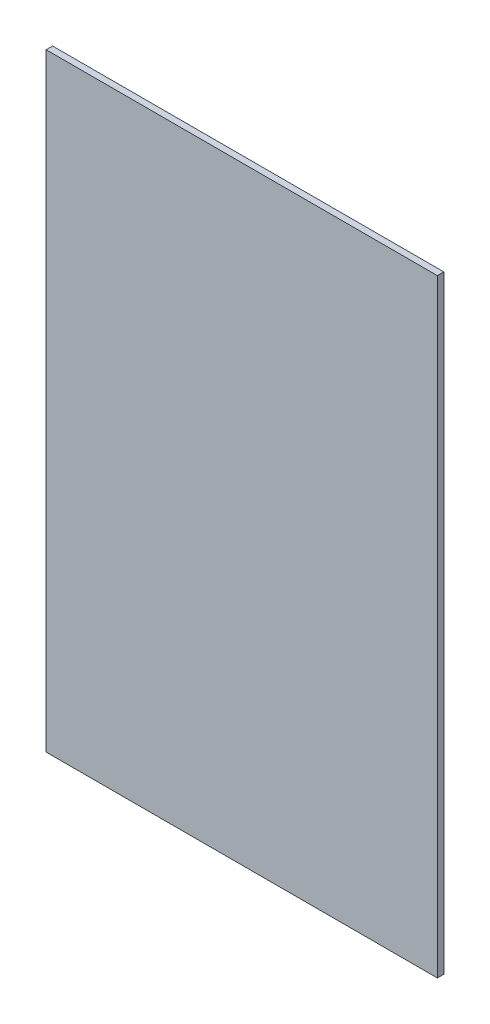
ISO-10303-21;
HEADER;
FILE_DESCRIPTION(('STEP AP214'),'2;1');
FILE_NAME('part.step','',(''),(''),'','','');
FILE_SCHEMA(('AUTOMOTIVE_DESIGN { 1 0 10303 214 1 1 1 1 }'));
ENDSEC;
DATA;
#1=APPLICATION_CONTEXT('core data for automotive mechanical design processes');
#2=APPLICATION_PROTOCOL_DEFINITION('international standard','automotive_design',2000,#1);
#3=PRODUCT_CONTEXT('',#1,'mechanical');
#4=PRODUCT('Part','Part','',(#3));
#5=PRODUCT_RELATED_PRODUCT_CATEGORY('part','',(#4));
#6=PRODUCT_DEFINITION_FORMATION('','',#4);
#7=PRODUCT_DEFINITION_CONTEXT('part definition',#1,'design');
#8=PRODUCT_DEFINITION('design','',#6,#7);
#9=PRODUCT_DEFINITION_SHAPE('','',#8);
#10=(LENGTH_UNIT() NAMED_UNIT(*) SI_UNIT(.MILLI.,.METRE.));
#11=(NAMED_UNIT(*) PLANE_ANGLE_UNIT() SI_UNIT($,.RADIAN.));
#12=(NAMED_UNIT(*) SI_UNIT($,.STERADIAN.) SOLID_ANGLE_UNIT());
#13=UNCERTAINTY_MEASURE_WITH_UNIT(LENGTH_MEASURE(1.E-05),#10,'distance_accuracy_value','');
#14=(GEOMETRIC_REPRESENTATION_CONTEXT(3) GLOBAL_UNCERTAINTY_ASSIGNED_CONTEXT((#13)) GLOBAL_UNIT_ASSIGNED_CONTEXT((#10,
#11,#12)) REPRESENTATION_CONTEXT('',''));
#15=CARTESIAN_POINT('',(0.,0.,0.));
#16=DIRECTION('',(0.,0.,1.));
#17=DIRECTION('',(1.,0.,0.));
#18=AXIS2_PLACEMENT_3D('',#15,#16,#17);
#19=CARTESIAN_POINT('',(302.35,470.,10.));
#20=DIRECTION('',(-1.,0.,0.));
#21=DIRECTION('',(0.,-1.,0.));
#22=AXIS2_PLACEMENT_3D('',#19,#20,#21);
#23=PLANE('',#22);
#24=DIRECTION('',(0.,1.,0.));
#25=VECTOR('',#24,1.);
#26=CARTESIAN_POINT('',(302.35,470.,0.));
#27=LINE('',#26,#25);
#28=CARTESIAN_POINT('',(302.35,-470.,0.));
#29=VERTEX_POINT('',#28);
#30=CARTESIAN_POINT('',(302.35,470.,0.));
#31=VERTEX_POINT('',#30);
#32=EDGE_CURVE('E105',#29,#31,#27,.T.);
#33=ORIENTED_EDGE('',*,*,#32,.T.);
#34=DIRECTION('',(0.,0.,-1.));
#35=VECTOR('',#34,1.);
#36=CARTESIAN_POINT('',(302.35,470.,10.));
#37=LINE('',#36,#35);
#38=CARTESIAN_POINT('',(302.35,470.,10.));
#39=VERTEX_POINT('',#38);
#40=EDGE_CURVE('E11',#39,#31,#37,.T.);
#41=ORIENTED_EDGE('',*,*,#40,.F.);
#42=DIRECTION('',(0.,1.,0.));
#43=VECTOR('',#42,1.);
#44=CARTESIAN_POINT('',(302.35,470.,10.));
#45=LINE('',#44,#43);
#46=CARTESIAN_POINT('',(302.35,-470.,10.));
#47=VERTEX_POINT('',#46);
#48=EDGE_CURVE('E89',#47,#39,#45,.T.);
#49=ORIENTED_EDGE('',*,*,#48,.F.);
#50=DIRECTION('',(0.,0.,-1.));
#51=VECTOR('',#50,1.);
#52=CARTESIAN_POINT('',(302.35,-470.,10.));
#53=LINE('',#52,#51);
#54=EDGE_CURVE('E97',#47,#29,#53,.T.);
#55=ORIENTED_EDGE('',*,*,#54,.T.);
#56=EDGE_LOOP('',(#33,#41,#49,#55));
#57=FACE_BOUND('',#56,.T.);
#58=ADVANCED_FACE('F39',(#57),#23,.F.);
#59=CARTESIAN_POINT('',(-302.35,470.,10.));
#60=DIRECTION('',(0.,-1.,0.));
#61=DIRECTION('',(0.,0.,-1.));
#62=AXIS2_PLACEMENT_3D('',#59,#60,#61);
#63=PLANE('',#62);
#64=DIRECTION('',(-1.,0.,0.));
#65=VECTOR('',#64,1.);
#66=CARTESIAN_POINT('',(-302.35,470.,0.));
#67=LINE('',#66,#65);
#68=CARTESIAN_POINT('',(-302.35,470.,0.));
#69=VERTEX_POINT('',#68);
#70=EDGE_CURVE('E92',#31,#69,#67,.T.);
#71=ORIENTED_EDGE('',*,*,#70,.T.);
#72=DIRECTION('',(0.,0.,-1.));
#73=VECTOR('',#72,1.);
#74=CARTESIAN_POINT('',(-302.35,470.,10.));
#75=LINE('',#74,#73);
#76=CARTESIAN_POINT('',(-302.35,470.,10.));
#77=VERTEX_POINT('',#76);
#78=EDGE_CURVE('E50',#77,#69,#75,.T.);
#79=ORIENTED_EDGE('',*,*,#78,.F.);
#80=DIRECTION('',(-1.,0.,0.));
#81=VECTOR('',#80,1.);
#82=CARTESIAN_POINT('',(-302.35,470.,10.));
#83=LINE('',#82,#81);
#84=EDGE_CURVE('E82',#39,#77,#83,.T.);
#85=ORIENTED_EDGE('',*,*,#84,.F.);
#86=ORIENTED_EDGE('',*,*,#40,.T.);
#87=EDGE_LOOP('',(#71,#79,#85,#86));
#88=FACE_BOUND('',#87,.T.);
#89=ADVANCED_FACE('F93',(#88),#63,.F.);
#90=CARTESIAN_POINT('',(-302.35,470.,10.));
#91=DIRECTION('',(1.,0.,0.));
#92=DIRECTION('',(0.,1.,0.));
#93=AXIS2_PLACEMENT_3D('',#90,#91,#92);
#94=PLANE('',#93);
#95=DIRECTION('',(0.,-1.,0.));
#96=VECTOR('',#95,1.);
#97=CARTESIAN_POINT('',(-302.35,470.,0.));
#98=LINE('',#97,#96);
#99=CARTESIAN_POINT('',(-302.35,-470.,0.));
#100=VERTEX_POINT('',#99);
#101=EDGE_CURVE('E72',#69,#100,#98,.T.);
#102=ORIENTED_EDGE('',*,*,#101,.T.);
#103=DIRECTION('',(0.,0.,-1.));
#104=VECTOR('',#103,1.);
#105=CARTESIAN_POINT('',(-302.35,-470.,10.));
#106=LINE('',#105,#104);
#107=CARTESIAN_POINT('',(-302.35,-470.,10.));
#108=VERTEX_POINT('',#107);
#109=EDGE_CURVE('E94',#108,#100,#106,.T.);
#110=ORIENTED_EDGE('',*,*,#109,.F.);
#111=DIRECTION('',(0.,-1.,0.));
#112=VECTOR('',#111,1.);
#113=CARTESIAN_POINT('',(-302.35,470.,10.));
#114=LINE('',#113,#112);
#115=EDGE_CURVE('E88',#77,#108,#114,.T.);
#116=ORIENTED_EDGE('',*,*,#115,.F.);
#117=ORIENTED_EDGE('',*,*,#78,.T.);
#118=EDGE_LOOP('',(#102,#110,#116,#117));
#119=FACE_BOUND('',#118,.T.);
#120=ADVANCED_FACE('F96',(#119),#94,.F.);
#121=CARTESIAN_POINT('',(-302.35,-470.,10.));
#122=DIRECTION('',(0.,1.,0.));
#123=DIRECTION('',(0.,0.,1.));
#124=AXIS2_PLACEMENT_3D('',#121,#122,#123);
#125=PLANE('',#124);
#126=DIRECTION('',(1.,0.,0.));
#127=VECTOR('',#126,1.);
#128=CARTESIAN_POINT('',(-302.35,-470.,0.));
#129=LINE('',#128,#127);
#130=EDGE_CURVE('E76',#100,#29,#129,.T.);
#131=ORIENTED_EDGE('',*,*,#130,.T.);
#132=ORIENTED_EDGE('',*,*,#54,.F.);
#133=DIRECTION('',(1.,0.,0.));
#134=VECTOR('',#133,1.);
#135=CARTESIAN_POINT('',(-302.35,-470.,10.));
#136=LINE('',#135,#134);
#137=EDGE_CURVE('E54',#108,#47,#136,.T.);
#138=ORIENTED_EDGE('',*,*,#137,.F.);
#139=ORIENTED_EDGE('',*,*,#109,.T.);
#140=EDGE_LOOP('',(#131,#132,#138,#139));
#141=FACE_BOUND('',#140,.T.);
#142=ADVANCED_FACE('F108',(#141),#125,.F.);
#143=CARTESIAN_POINT('',(0.,0.,10.));
#144=DIRECTION('',(0.,0.,1.));
#145=DIRECTION('',(1.,0.,0.));
#146=AXIS2_PLACEMENT_3D('',#143,#144,#145);
#147=PLANE('',#146);
#148=ORIENTED_EDGE('',*,*,#48,.T.);
#149=ORIENTED_EDGE('',*,*,#84,.T.);
#150=ORIENTED_EDGE('',*,*,#115,.T.);
#151=ORIENTED_EDGE('',*,*,#137,.T.);
#152=EDGE_LOOP('',(#148,#149,#150,#151));
#153=FACE_BOUND('',#152,.T.);
#154=ADVANCED_FACE('F86',(#153),#147,.T.);
#155=CARTESIAN_POINT('',(0.,0.,0.));
#156=DIRECTION('',(0.,0.,1.));
#157=DIRECTION('',(1.,0.,0.));
#158=AXIS2_PLACEMENT_3D('',#155,#156,#157);
#159=PLANE('',#158);
#160=ORIENTED_EDGE('',*,*,#32,.F.);
#161=ORIENTED_EDGE('',*,*,#130,.F.);
#162=ORIENTED_EDGE('',*,*,#101,.F.);
#163=ORIENTED_EDGE('',*,*,#70,.F.);
#164=EDGE_LOOP('',(#160,#161,#162,#163));
#165=FACE_BOUND('',#164,.T.);
#166=ADVANCED_FACE('F115',(#165),#159,.F.);
#167=CLOSED_SHELL('',(#58,#89,#120,#142,#154,#166));
#168=MANIFOLD_SOLID_BREP('B2',#167);
#169=ADVANCED_BREP_SHAPE_REPRESENTATION('',(#18,#168),#14);
#170=SHAPE_DEFINITION_REPRESENTATION(#9,#169);
ENDSEC;
END-ISO-10303-21;
